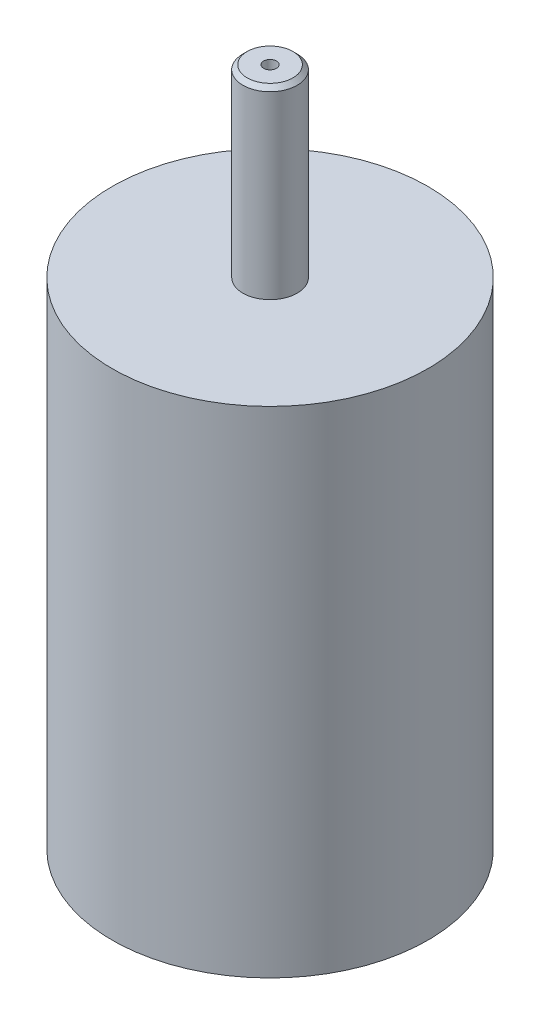
ISO-10303-21;
HEADER;
FILE_DESCRIPTION(('STEP AP214'),'2;1');
FILE_NAME('part.step','',(''),(''),'','','');
FILE_SCHEMA(('AUTOMOTIVE_DESIGN { 1 0 10303 214 1 1 1 1 }'));
ENDSEC;
DATA;
#1=APPLICATION_CONTEXT('core data for automotive mechanical design processes');
#2=APPLICATION_PROTOCOL_DEFINITION('international standard','automotive_design',2000,#1);
#3=PRODUCT_CONTEXT('',#1,'mechanical');
#4=PRODUCT('Part','Part','',(#3));
#5=PRODUCT_RELATED_PRODUCT_CATEGORY('part','',(#4));
#6=PRODUCT_DEFINITION_FORMATION('','',#4);
#7=PRODUCT_DEFINITION_CONTEXT('part definition',#1,'design');
#8=PRODUCT_DEFINITION('design','',#6,#7);
#9=PRODUCT_DEFINITION_SHAPE('','',#8);
#10=(LENGTH_UNIT() NAMED_UNIT(*) SI_UNIT(.MILLI.,.METRE.));
#11=(NAMED_UNIT(*) PLANE_ANGLE_UNIT() SI_UNIT($,.RADIAN.));
#12=(NAMED_UNIT(*) SI_UNIT($,.STERADIAN.) SOLID_ANGLE_UNIT());
#13=UNCERTAINTY_MEASURE_WITH_UNIT(LENGTH_MEASURE(1.E-05),#10,'distance_accuracy_value','');
#14=(GEOMETRIC_REPRESENTATION_CONTEXT(3) GLOBAL_UNCERTAINTY_ASSIGNED_CONTEXT((#13)) GLOBAL_UNIT_ASSIGNED_CONTEXT((#10,
#11,#12)) REPRESENTATION_CONTEXT('',''));
#15=CARTESIAN_POINT('',(0.,0.,0.));
#16=DIRECTION('',(0.,0.,1.));
#17=DIRECTION('',(1.,0.,0.));
#18=AXIS2_PLACEMENT_3D('',#15,#16,#17);
#19=CARTESIAN_POINT('',(0.,40.8,0.));
#20=DIRECTION('',(0.,1.,0.));
#21=DIRECTION('',(0.,0.,1.));
#22=AXIS2_PLACEMENT_3D('',#19,#20,#21);
#23=PLANE('',#22);
#24=CARTESIAN_POINT('',(0.,40.8,0.));
#25=DIRECTION('',(0.,1.,0.));
#26=DIRECTION('',(0.,0.,1.));
#27=AXIS2_PLACEMENT_3D('',#24,#25,#26);
#28=CIRCLE('',#27,0.75);
#29=CARTESIAN_POINT('',(0.,40.8,0.750000000000005));
#30=VERTEX_POINT('',#29);
#31=EDGE_CURVE('E66',#30,#30,#28,.T.);
#32=ORIENTED_EDGE('',*,*,#31,.F.);
#33=EDGE_LOOP('',(#32));
#34=FACE_BOUND('',#33,.T.);
#35=CARTESIAN_POINT('',(0.,40.8,0.));
#36=DIRECTION('',(0.,1.,0.));
#37=DIRECTION('',(0.,0.,1.));
#38=AXIS2_PLACEMENT_3D('',#35,#36,#37);
#39=CIRCLE('',#38,2.67999999999997);
#40=CARTESIAN_POINT('',(0.,40.8,2.67999999999999));
#41=VERTEX_POINT('',#40);
#42=EDGE_CURVE('E10',#41,#41,#39,.T.);
#43=ORIENTED_EDGE('',*,*,#42,.T.);
#44=EDGE_LOOP('',(#43));
#45=FACE_BOUND('',#44,.T.);
#46=ADVANCED_FACE('F36',(#34,#45),#23,.T.);
#47=CARTESIAN_POINT('',(0.,-40.8,0.));
#48=DIRECTION('',(0.,-1.,0.));
#49=DIRECTION('',(0.,0.,-1.));
#50=AXIS2_PLACEMENT_3D('',#47,#48,#49);
#51=CYLINDRICAL_SURFACE('',#50,3.18);
#52=CARTESIAN_POINT('',(0.,40.3,0.));
#53=DIRECTION('',(0.,1.,0.));
#54=DIRECTION('',(0.,0.,1.));
#55=AXIS2_PLACEMENT_3D('',#52,#53,#54);
#56=CIRCLE('',#55,3.18);
#57=CARTESIAN_POINT('',(0.,40.3,3.18000000000001));
#58=VERTEX_POINT('',#57);
#59=EDGE_CURVE('E43',#58,#58,#56,.F.);
#60=ORIENTED_EDGE('',*,*,#59,.T.);
#61=EDGE_LOOP('',(#60));
#62=FACE_BOUND('',#61,.T.);
#63=CARTESIAN_POINT('',(0.,19.2,0.));
#64=DIRECTION('',(0.,-1.,0.));
#65=DIRECTION('',(0.,0.,-1.));
#66=AXIS2_PLACEMENT_3D('',#63,#64,#65);
#67=CIRCLE('',#66,3.18);
#68=CARTESIAN_POINT('',(0.,19.2,-3.17999999999999));
#69=VERTEX_POINT('',#68);
#70=EDGE_CURVE('E47',#69,#69,#67,.T.);
#71=ORIENTED_EDGE('',*,*,#70,.F.);
#72=EDGE_LOOP('',(#71));
#73=FACE_BOUND('',#72,.T.);
#74=ADVANCED_FACE('F82',(#62,#73),#51,.T.);
#75=CARTESIAN_POINT('',(0.,19.2,-3.17999999999999));
#76=DIRECTION('',(0.,1.,0.));
#77=DIRECTION('',(0.,0.,1.));
#78=AXIS2_PLACEMENT_3D('',#75,#76,#77);
#79=PLANE('',#78);
#80=ORIENTED_EDGE('',*,*,#70,.T.);
#81=EDGE_LOOP('',(#80));
#82=FACE_BOUND('',#81,.T.);
#83=CARTESIAN_POINT('',(0.,19.2,0.));
#84=DIRECTION('',(0.,-1.,0.));
#85=DIRECTION('',(0.,0.,-1.));
#86=AXIS2_PLACEMENT_3D('',#83,#84,#85);
#87=CIRCLE('',#86,18.5);
#88=CARTESIAN_POINT('',(0.,19.2,-18.5));
#89=VERTEX_POINT('',#88);
#90=EDGE_CURVE('E51',#89,#89,#87,.T.);
#91=ORIENTED_EDGE('',*,*,#90,.F.);
#92=EDGE_LOOP('',(#91));
#93=FACE_BOUND('',#92,.T.);
#94=ADVANCED_FACE('F86',(#82,#93),#79,.T.);
#95=CARTESIAN_POINT('',(0.,-40.8,0.));
#96=DIRECTION('',(0.,-1.,0.));
#97=DIRECTION('',(0.,0.,-1.));
#98=AXIS2_PLACEMENT_3D('',#95,#96,#97);
#99=CYLINDRICAL_SURFACE('',#98,18.5);
#100=ORIENTED_EDGE('',*,*,#90,.T.);
#101=EDGE_LOOP('',(#100));
#102=FACE_BOUND('',#101,.T.);
#103=CARTESIAN_POINT('',(0.,-38.8,0.));
#104=DIRECTION('',(0.,-1.,0.));
#105=DIRECTION('',(0.,0.,-1.));
#106=AXIS2_PLACEMENT_3D('',#103,#104,#105);
#107=CIRCLE('',#106,18.5);
#108=CARTESIAN_POINT('',(0.,-38.8,-18.5));
#109=VERTEX_POINT('',#108);
#110=EDGE_CURVE('E56',#109,#109,#107,.T.);
#111=ORIENTED_EDGE('',*,*,#110,.F.);
#112=EDGE_LOOP('',(#111));
#113=FACE_BOUND('',#112,.T.);
#114=ADVANCED_FACE('F91',(#102,#113),#99,.T.);
#115=CARTESIAN_POINT('',(0.,-38.8,-18.5));
#116=DIRECTION('',(0.,-1.,0.));
#117=DIRECTION('',(0.,0.,-1.));
#118=AXIS2_PLACEMENT_3D('',#115,#116,#117);
#119=PLANE('',#118);
#120=ORIENTED_EDGE('',*,*,#110,.T.);
#121=EDGE_LOOP('',(#120));
#122=FACE_BOUND('',#121,.T.);
#123=CARTESIAN_POINT('',(0.,-38.8,0.));
#124=DIRECTION('',(0.,-1.,0.));
#125=DIRECTION('',(0.,0.,-1.));
#126=AXIS2_PLACEMENT_3D('',#123,#124,#125);
#127=CIRCLE('',#126,3.18);
#128=CARTESIAN_POINT('',(0.,-38.8,-3.18));
#129=VERTEX_POINT('',#128);
#130=EDGE_CURVE('E59',#129,#129,#127,.T.);
#131=ORIENTED_EDGE('',*,*,#130,.F.);
#132=EDGE_LOOP('',(#131));
#133=FACE_BOUND('',#132,.T.);
#134=ADVANCED_FACE('F95',(#122,#133),#119,.T.);
#135=CARTESIAN_POINT('',(0.,-40.8,0.));
#136=DIRECTION('',(0.,-1.,0.));
#137=DIRECTION('',(0.,0.,-1.));
#138=AXIS2_PLACEMENT_3D('',#135,#136,#137);
#139=CYLINDRICAL_SURFACE('',#138,3.18);
#140=ORIENTED_EDGE('',*,*,#130,.T.);
#141=EDGE_LOOP('',(#140));
#142=FACE_BOUND('',#141,.T.);
#143=CARTESIAN_POINT('',(0.,-40.8,0.));
#144=DIRECTION('',(0.,-1.,0.));
#145=DIRECTION('',(0.,0.,-1.));
#146=AXIS2_PLACEMENT_3D('',#143,#144,#145);
#147=CIRCLE('',#146,3.18);
#148=CARTESIAN_POINT('',(0.,-40.8,-3.18));
#149=VERTEX_POINT('',#148);
#150=EDGE_CURVE('E62',#149,#149,#147,.T.);
#151=ORIENTED_EDGE('',*,*,#150,.F.);
#152=EDGE_LOOP('',(#151));
#153=FACE_BOUND('',#152,.T.);
#154=ADVANCED_FACE('F99',(#142,#153),#139,.T.);
#155=CARTESIAN_POINT('',(0.,-40.8,-3.18));
#156=DIRECTION('',(0.,-1.,0.));
#157=DIRECTION('',(0.,0.,-1.));
#158=AXIS2_PLACEMENT_3D('',#155,#156,#157);
#159=PLANE('',#158);
#160=CARTESIAN_POINT('',(0.,-40.8,0.));
#161=DIRECTION('',(0.,1.,0.));
#162=DIRECTION('',(0.,0.,1.));
#163=AXIS2_PLACEMENT_3D('',#160,#161,#162);
#164=CIRCLE('',#163,0.75);
#165=CARTESIAN_POINT('',(0.,-40.8,0.749999999999995));
#166=VERTEX_POINT('',#165);
#167=EDGE_CURVE('E65',#166,#166,#164,.T.);
#168=ORIENTED_EDGE('',*,*,#167,.T.);
#169=EDGE_LOOP('',(#168));
#170=FACE_BOUND('',#169,.T.);
#171=ORIENTED_EDGE('',*,*,#150,.T.);
#172=EDGE_LOOP('',(#171));
#173=FACE_BOUND('',#172,.T.);
#174=ADVANCED_FACE('F72',(#170,#173),#159,.T.);
#175=CARTESIAN_POINT('',(0.,40.3,0.));
#176=DIRECTION('',(0.,-1.,0.));
#177=DIRECTION('',(0.,0.,-1.));
#178=AXIS2_PLACEMENT_3D('',#175,#176,#177);
#179=CONICAL_SURFACE('',#178,3.18,0.785398163397449);
#180=ORIENTED_EDGE('',*,*,#42,.F.);
#181=EDGE_LOOP('',(#180));
#182=FACE_BOUND('',#181,.T.);
#183=ORIENTED_EDGE('',*,*,#59,.F.);
#184=EDGE_LOOP('',(#183));
#185=FACE_BOUND('',#184,.T.);
#186=ADVANCED_FACE('F38',(#182,#185),#179,.T.);
#187=CARTESIAN_POINT('',(0.,-40.8,0.));
#188=DIRECTION('',(0.,1.,0.));
#189=DIRECTION('',(0.,0.,1.));
#190=AXIS2_PLACEMENT_3D('',#187,#188,#189);
#191=CYLINDRICAL_SURFACE('',#190,0.75);
#192=ORIENTED_EDGE('',*,*,#167,.F.);
#193=EDGE_LOOP('',(#192));
#194=FACE_BOUND('',#193,.T.);
#195=ORIENTED_EDGE('',*,*,#31,.T.);
#196=EDGE_LOOP('',(#195));
#197=FACE_BOUND('',#196,.T.);
#198=ADVANCED_FACE('F75',(#194,#197),#191,.F.);
#199=CLOSED_SHELL('',(#46,#74,#94,#114,#134,#154,#174,#186,#198));
#200=MANIFOLD_SOLID_BREP('B2',#199);
#201=ADVANCED_BREP_SHAPE_REPRESENTATION('',(#18,#200),#14);
#202=SHAPE_DEFINITION_REPRESENTATION(#9,#201);
ENDSEC;
END-ISO-10303-21;
